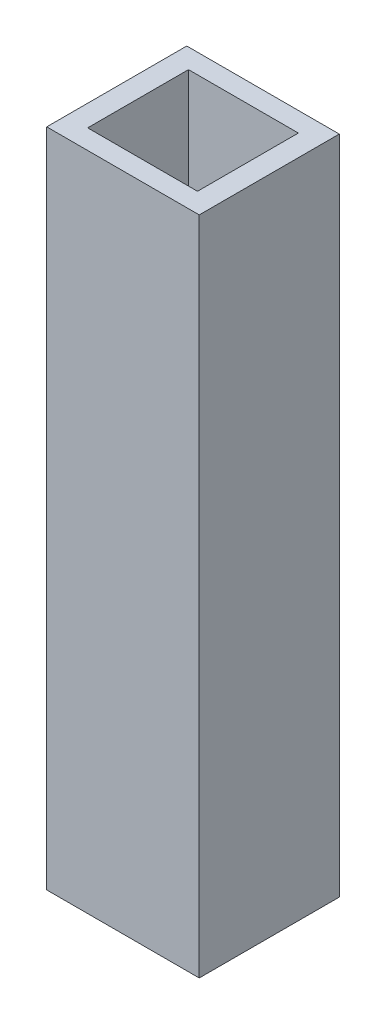
ISO-10303-21;
HEADER;
FILE_DESCRIPTION(('STEP AP214'),'2;1');
FILE_NAME('part.step','',(''),(''),'','','');
FILE_SCHEMA(('AUTOMOTIVE_DESIGN { 1 0 10303 214 1 1 1 1 }'));
ENDSEC;
DATA;
#1=APPLICATION_CONTEXT('core data for automotive mechanical design processes');
#2=APPLICATION_PROTOCOL_DEFINITION('international standard','automotive_design',2000,#1);
#3=PRODUCT_CONTEXT('',#1,'mechanical');
#4=PRODUCT('Part','Part','',(#3));
#5=PRODUCT_RELATED_PRODUCT_CATEGORY('part','',(#4));
#6=PRODUCT_DEFINITION_FORMATION('','',#4);
#7=PRODUCT_DEFINITION_CONTEXT('part definition',#1,'design');
#8=PRODUCT_DEFINITION('design','',#6,#7);
#9=PRODUCT_DEFINITION_SHAPE('','',#8);
#10=(LENGTH_UNIT() NAMED_UNIT(*) SI_UNIT(.MILLI.,.METRE.));
#11=(NAMED_UNIT(*) PLANE_ANGLE_UNIT() SI_UNIT($,.RADIAN.));
#12=(NAMED_UNIT(*) SI_UNIT($,.STERADIAN.) SOLID_ANGLE_UNIT());
#13=UNCERTAINTY_MEASURE_WITH_UNIT(LENGTH_MEASURE(1.E-05),#10,'distance_accuracy_value','');
#14=(GEOMETRIC_REPRESENTATION_CONTEXT(3) GLOBAL_UNCERTAINTY_ASSIGNED_CONTEXT((#13)) GLOBAL_UNIT_ASSIGNED_CONTEXT((#10,
#11,#12)) REPRESENTATION_CONTEXT('',''));
#15=CARTESIAN_POINT('',(0.,0.,0.));
#16=DIRECTION('',(0.,0.,1.));
#17=DIRECTION('',(1.,0.,0.));
#18=AXIS2_PLACEMENT_3D('',#15,#16,#17);
#19=CARTESIAN_POINT('',(0.,130.,0.));
#20=DIRECTION('',(0.,1.,0.));
#21=DIRECTION('',(0.,0.,1.));
#22=AXIS2_PLACEMENT_3D('',#19,#20,#21);
#23=PLANE('',#22);
#24=DIRECTION('',(0.,0.,-1.));
#25=VECTOR('',#24,1.);
#26=CARTESIAN_POINT('',(15.,130.,-13.7727272727273));
#27=LINE('',#26,#25);
#28=CARTESIAN_POINT('',(15.,130.,13.7727272727273));
#29=VERTEX_POINT('',#28);
#30=CARTESIAN_POINT('',(15.,130.,-13.7727272727273));
#31=VERTEX_POINT('',#30);
#32=EDGE_CURVE('E134',#29,#31,#27,.T.);
#33=ORIENTED_EDGE('',*,*,#32,.T.);
#34=DIRECTION('',(-1.,0.,0.));
#35=VECTOR('',#34,1.);
#36=CARTESIAN_POINT('',(-15.,130.,-13.7727272727273));
#37=LINE('',#36,#35);
#38=CARTESIAN_POINT('',(-15.,130.,-13.7727272727273));
#39=VERTEX_POINT('',#38);
#40=EDGE_CURVE('E137',#31,#39,#37,.T.);
#41=ORIENTED_EDGE('',*,*,#40,.T.);
#42=DIRECTION('',(0.,0.,1.));
#43=VECTOR('',#42,1.);
#44=CARTESIAN_POINT('',(-15.,130.,-13.7727272727273));
#45=LINE('',#44,#43);
#46=CARTESIAN_POINT('',(-15.,130.,13.7727272727273));
#47=VERTEX_POINT('',#46);
#48=EDGE_CURVE('E140',#39,#47,#45,.T.);
#49=ORIENTED_EDGE('',*,*,#48,.T.);
#50=DIRECTION('',(1.,0.,0.));
#51=VECTOR('',#50,1.);
#52=CARTESIAN_POINT('',(-15.,130.,13.7727272727273));
#53=LINE('',#52,#51);
#54=EDGE_CURVE('E142',#47,#29,#53,.T.);
#55=ORIENTED_EDGE('',*,*,#54,.T.);
#56=EDGE_LOOP('',(#33,#41,#49,#55));
#57=FACE_BOUND('',#56,.T.);
#58=DIRECTION('',(-1.,0.,0.));
#59=VECTOR('',#58,1.);
#60=CARTESIAN_POINT('',(-10.8042240258284,130.,-9.92024206007883));
#61=LINE('',#60,#59);
#62=CARTESIAN_POINT('',(10.8042240258284,130.,-9.92024206007883));
#63=VERTEX_POINT('',#62);
#64=CARTESIAN_POINT('',(-10.8042240258284,130.,-9.92024206007883));
#65=VERTEX_POINT('',#64);
#66=EDGE_CURVE('E106',#63,#65,#61,.T.);
#67=ORIENTED_EDGE('',*,*,#66,.F.);
#68=DIRECTION('',(0.,0.,-1.));
#69=VECTOR('',#68,1.);
#70=CARTESIAN_POINT('',(10.8042240258284,130.,-9.92024206007883));
#71=LINE('',#70,#69);
#72=CARTESIAN_POINT('',(10.8042240258284,130.,9.92024206007883));
#73=VERTEX_POINT('',#72);
#74=EDGE_CURVE('E98',#73,#63,#71,.T.);
#75=ORIENTED_EDGE('',*,*,#74,.F.);
#76=DIRECTION('',(1.,0.,0.));
#77=VECTOR('',#76,1.);
#78=CARTESIAN_POINT('',(-10.8042240258284,130.,9.92024206007883));
#79=LINE('',#78,#77);
#80=CARTESIAN_POINT('',(-10.8042240258284,130.,9.92024206007883));
#81=VERTEX_POINT('',#80);
#82=EDGE_CURVE('E120',#81,#73,#79,.T.);
#83=ORIENTED_EDGE('',*,*,#82,.F.);
#84=DIRECTION('',(0.,0.,1.));
#85=VECTOR('',#84,1.);
#86=CARTESIAN_POINT('',(-10.8042240258284,130.,-9.92024206007883));
#87=LINE('',#86,#85);
#88=EDGE_CURVE('E118',#65,#81,#87,.T.);
#89=ORIENTED_EDGE('',*,*,#88,.F.);
#90=EDGE_LOOP('',(#67,#75,#83,#89));
#91=FACE_BOUND('',#90,.T.);
#92=ADVANCED_FACE('F33',(#57,#91),#23,.T.);
#93=CARTESIAN_POINT('',(0.,0.,0.));
#94=DIRECTION('',(0.,1.,0.));
#95=DIRECTION('',(0.,0.,1.));
#96=AXIS2_PLACEMENT_3D('',#93,#94,#95);
#97=PLANE('',#96);
#98=DIRECTION('',(0.,0.,-1.));
#99=VECTOR('',#98,1.);
#100=CARTESIAN_POINT('',(15.,0.,-13.7727272727273));
#101=LINE('',#100,#99);
#102=CARTESIAN_POINT('',(15.,0.,13.7727272727273));
#103=VERTEX_POINT('',#102);
#104=CARTESIAN_POINT('',(15.,0.,-13.7727272727273));
#105=VERTEX_POINT('',#104);
#106=EDGE_CURVE('E114',#103,#105,#101,.T.);
#107=ORIENTED_EDGE('',*,*,#106,.F.);
#108=DIRECTION('',(1.,0.,0.));
#109=VECTOR('',#108,1.);
#110=CARTESIAN_POINT('',(-15.,0.,13.7727272727273));
#111=LINE('',#110,#109);
#112=CARTESIAN_POINT('',(-15.,0.,13.7727272727273));
#113=VERTEX_POINT('',#112);
#114=EDGE_CURVE('E138',#113,#103,#111,.T.);
#115=ORIENTED_EDGE('',*,*,#114,.F.);
#116=DIRECTION('',(0.,0.,1.));
#117=VECTOR('',#116,1.);
#118=CARTESIAN_POINT('',(-15.,0.,-13.7727272727273));
#119=LINE('',#118,#117);
#120=CARTESIAN_POINT('',(-15.,0.,-13.7727272727273));
#121=VERTEX_POINT('',#120);
#122=EDGE_CURVE('E149',#121,#113,#119,.T.);
#123=ORIENTED_EDGE('',*,*,#122,.F.);
#124=DIRECTION('',(-1.,0.,0.));
#125=VECTOR('',#124,1.);
#126=CARTESIAN_POINT('',(-15.,0.,-13.7727272727273));
#127=LINE('',#126,#125);
#128=EDGE_CURVE('E147',#105,#121,#127,.T.);
#129=ORIENTED_EDGE('',*,*,#128,.F.);
#130=EDGE_LOOP('',(#107,#115,#123,#129));
#131=FACE_BOUND('',#130,.T.);
#132=DIRECTION('',(0.,0.,-1.));
#133=VECTOR('',#132,1.);
#134=CARTESIAN_POINT('',(10.8042240258284,0.,-9.92024206007883));
#135=LINE('',#134,#133);
#136=CARTESIAN_POINT('',(10.8042240258284,0.,9.92024206007883));
#137=VERTEX_POINT('',#136);
#138=CARTESIAN_POINT('',(10.8042240258284,0.,-9.92024206007883));
#139=VERTEX_POINT('',#138);
#140=EDGE_CURVE('E56',#137,#139,#135,.T.);
#141=ORIENTED_EDGE('',*,*,#140,.T.);
#142=DIRECTION('',(-1.,0.,0.));
#143=VECTOR('',#142,1.);
#144=CARTESIAN_POINT('',(-10.8042240258284,0.,-9.92024206007883));
#145=LINE('',#144,#143);
#146=CARTESIAN_POINT('',(-10.8042240258284,0.,-9.92024206007883));
#147=VERTEX_POINT('',#146);
#148=EDGE_CURVE('E113',#139,#147,#145,.T.);
#149=ORIENTED_EDGE('',*,*,#148,.T.);
#150=DIRECTION('',(0.,0.,1.));
#151=VECTOR('',#150,1.);
#152=CARTESIAN_POINT('',(-10.8042240258284,0.,-9.92024206007883));
#153=LINE('',#152,#151);
#154=CARTESIAN_POINT('',(-10.8042240258284,0.,9.92024206007883));
#155=VERTEX_POINT('',#154);
#156=EDGE_CURVE('E126',#147,#155,#153,.T.);
#157=ORIENTED_EDGE('',*,*,#156,.T.);
#158=DIRECTION('',(1.,0.,0.));
#159=VECTOR('',#158,1.);
#160=CARTESIAN_POINT('',(-10.8042240258284,0.,9.92024206007883));
#161=LINE('',#160,#159);
#162=EDGE_CURVE('E107',#155,#137,#161,.T.);
#163=ORIENTED_EDGE('',*,*,#162,.T.);
#164=EDGE_LOOP('',(#141,#149,#157,#163));
#165=FACE_BOUND('',#164,.T.);
#166=ADVANCED_FACE('F167',(#131,#165),#97,.F.);
#167=CARTESIAN_POINT('',(15.,130.,-13.7727272727273));
#168=DIRECTION('',(-1.,0.,0.));
#169=DIRECTION('',(0.,0.,1.));
#170=AXIS2_PLACEMENT_3D('',#167,#168,#169);
#171=PLANE('',#170);
#172=ORIENTED_EDGE('',*,*,#106,.T.);
#173=DIRECTION('',(0.,-1.,0.));
#174=VECTOR('',#173,1.);
#175=CARTESIAN_POINT('',(15.,130.,-13.7727272727273));
#176=LINE('',#175,#174);
#177=EDGE_CURVE('E11',#31,#105,#176,.T.);
#178=ORIENTED_EDGE('',*,*,#177,.F.);
#179=ORIENTED_EDGE('',*,*,#32,.F.);
#180=DIRECTION('',(0.,-1.,0.));
#181=VECTOR('',#180,1.);
#182=CARTESIAN_POINT('',(15.,130.,13.7727272727273));
#183=LINE('',#182,#181);
#184=EDGE_CURVE('E144',#29,#103,#183,.T.);
#185=ORIENTED_EDGE('',*,*,#184,.T.);
#186=EDGE_LOOP('',(#172,#178,#179,#185));
#187=FACE_BOUND('',#186,.T.);
#188=ADVANCED_FACE('F35',(#187),#171,.F.);
#189=CARTESIAN_POINT('',(-15.,130.,-13.7727272727273));
#190=DIRECTION('',(0.,0.,1.));
#191=DIRECTION('',(1.,0.,0.));
#192=AXIS2_PLACEMENT_3D('',#189,#190,#191);
#193=PLANE('',#192);
#194=ORIENTED_EDGE('',*,*,#128,.T.);
#195=DIRECTION('',(0.,-1.,0.));
#196=VECTOR('',#195,1.);
#197=CARTESIAN_POINT('',(-15.,130.,-13.7727272727273));
#198=LINE('',#197,#196);
#199=EDGE_CURVE('E41',#39,#121,#198,.T.);
#200=ORIENTED_EDGE('',*,*,#199,.F.);
#201=ORIENTED_EDGE('',*,*,#40,.F.);
#202=ORIENTED_EDGE('',*,*,#177,.T.);
#203=EDGE_LOOP('',(#194,#200,#201,#202));
#204=FACE_BOUND('',#203,.T.);
#205=ADVANCED_FACE('F177',(#204),#193,.F.);
#206=CARTESIAN_POINT('',(-15.,130.,-13.7727272727273));
#207=DIRECTION('',(1.,0.,0.));
#208=DIRECTION('',(0.,0.,-1.));
#209=AXIS2_PLACEMENT_3D('',#206,#207,#208);
#210=PLANE('',#209);
#211=ORIENTED_EDGE('',*,*,#122,.T.);
#212=DIRECTION('',(0.,-1.,0.));
#213=VECTOR('',#212,1.);
#214=CARTESIAN_POINT('',(-15.,130.,13.7727272727273));
#215=LINE('',#214,#213);
#216=EDGE_CURVE('E154',#47,#113,#215,.T.);
#217=ORIENTED_EDGE('',*,*,#216,.F.);
#218=ORIENTED_EDGE('',*,*,#48,.F.);
#219=ORIENTED_EDGE('',*,*,#199,.T.);
#220=EDGE_LOOP('',(#211,#217,#218,#219));
#221=FACE_BOUND('',#220,.T.);
#222=ADVANCED_FACE('F161',(#221),#210,.F.);
#223=CARTESIAN_POINT('',(-15.,130.,13.7727272727273));
#224=DIRECTION('',(0.,0.,-1.));
#225=DIRECTION('',(-1.,0.,0.));
#226=AXIS2_PLACEMENT_3D('',#223,#224,#225);
#227=PLANE('',#226);
#228=ORIENTED_EDGE('',*,*,#114,.T.);
#229=ORIENTED_EDGE('',*,*,#184,.F.);
#230=ORIENTED_EDGE('',*,*,#54,.F.);
#231=ORIENTED_EDGE('',*,*,#216,.T.);
#232=EDGE_LOOP('',(#228,#229,#230,#231));
#233=FACE_BOUND('',#232,.T.);
#234=ADVANCED_FACE('F171',(#233),#227,.F.);
#235=CARTESIAN_POINT('',(10.8042240258284,130.,-9.92024206007883));
#236=DIRECTION('',(-1.,0.,0.));
#237=DIRECTION('',(0.,0.,1.));
#238=AXIS2_PLACEMENT_3D('',#235,#236,#237);
#239=PLANE('',#238);
#240=ORIENTED_EDGE('',*,*,#140,.F.);
#241=DIRECTION('',(0.,-1.,0.));
#242=VECTOR('',#241,1.);
#243=CARTESIAN_POINT('',(10.8042240258284,130.,9.92024206007883));
#244=LINE('',#243,#242);
#245=EDGE_CURVE('E102',#73,#137,#244,.T.);
#246=ORIENTED_EDGE('',*,*,#245,.F.);
#247=ORIENTED_EDGE('',*,*,#74,.T.);
#248=DIRECTION('',(0.,-1.,0.));
#249=VECTOR('',#248,1.);
#250=CARTESIAN_POINT('',(10.8042240258284,130.,-9.92024206007883));
#251=LINE('',#250,#249);
#252=EDGE_CURVE('E101',#63,#139,#251,.T.);
#253=ORIENTED_EDGE('',*,*,#252,.T.);
#254=EDGE_LOOP('',(#240,#246,#247,#253));
#255=FACE_BOUND('',#254,.T.);
#256=ADVANCED_FACE('F100',(#255),#239,.T.);
#257=CARTESIAN_POINT('',(-10.8042240258284,130.,-9.92024206007883));
#258=DIRECTION('',(0.,0.,1.));
#259=DIRECTION('',(1.,0.,0.));
#260=AXIS2_PLACEMENT_3D('',#257,#258,#259);
#261=PLANE('',#260);
#262=ORIENTED_EDGE('',*,*,#148,.F.);
#263=ORIENTED_EDGE('',*,*,#252,.F.);
#264=ORIENTED_EDGE('',*,*,#66,.T.);
#265=DIRECTION('',(0.,-1.,0.));
#266=VECTOR('',#265,1.);
#267=CARTESIAN_POINT('',(-10.8042240258284,130.,-9.92024206007883));
#268=LINE('',#267,#266);
#269=EDGE_CURVE('E115',#65,#147,#268,.T.);
#270=ORIENTED_EDGE('',*,*,#269,.T.);
#271=EDGE_LOOP('',(#262,#263,#264,#270));
#272=FACE_BOUND('',#271,.T.);
#273=ADVANCED_FACE('F110',(#272),#261,.T.);
#274=CARTESIAN_POINT('',(-10.8042240258284,130.,-9.92024206007883));
#275=DIRECTION('',(1.,0.,0.));
#276=DIRECTION('',(0.,0.,-1.));
#277=AXIS2_PLACEMENT_3D('',#274,#275,#276);
#278=PLANE('',#277);
#279=ORIENTED_EDGE('',*,*,#156,.F.);
#280=ORIENTED_EDGE('',*,*,#269,.F.);
#281=ORIENTED_EDGE('',*,*,#88,.T.);
#282=DIRECTION('',(0.,-1.,0.));
#283=VECTOR('',#282,1.);
#284=CARTESIAN_POINT('',(-10.8042240258284,130.,9.92024206007883));
#285=LINE('',#284,#283);
#286=EDGE_CURVE('E48',#81,#155,#285,.T.);
#287=ORIENTED_EDGE('',*,*,#286,.T.);
#288=EDGE_LOOP('',(#279,#280,#281,#287));
#289=FACE_BOUND('',#288,.T.);
#290=ADVANCED_FACE('F200',(#289),#278,.T.);
#291=CARTESIAN_POINT('',(-10.8042240258284,130.,9.92024206007883));
#292=DIRECTION('',(0.,0.,-1.));
#293=DIRECTION('',(-1.,0.,0.));
#294=AXIS2_PLACEMENT_3D('',#291,#292,#293);
#295=PLANE('',#294);
#296=ORIENTED_EDGE('',*,*,#162,.F.);
#297=ORIENTED_EDGE('',*,*,#286,.F.);
#298=ORIENTED_EDGE('',*,*,#82,.T.);
#299=ORIENTED_EDGE('',*,*,#245,.T.);
#300=EDGE_LOOP('',(#296,#297,#298,#299));
#301=FACE_BOUND('',#300,.T.);
#302=ADVANCED_FACE('F204',(#301),#295,.T.);
#303=CLOSED_SHELL('',(#92,#166,#188,#205,#222,#234,#256,#273,#290,#302));
#304=MANIFOLD_SOLID_BREP('B2',#303);
#305=ADVANCED_BREP_SHAPE_REPRESENTATION('',(#18,#304),#14);
#306=SHAPE_DEFINITION_REPRESENTATION(#9,#305);
ENDSEC;
END-ISO-10303-21;
